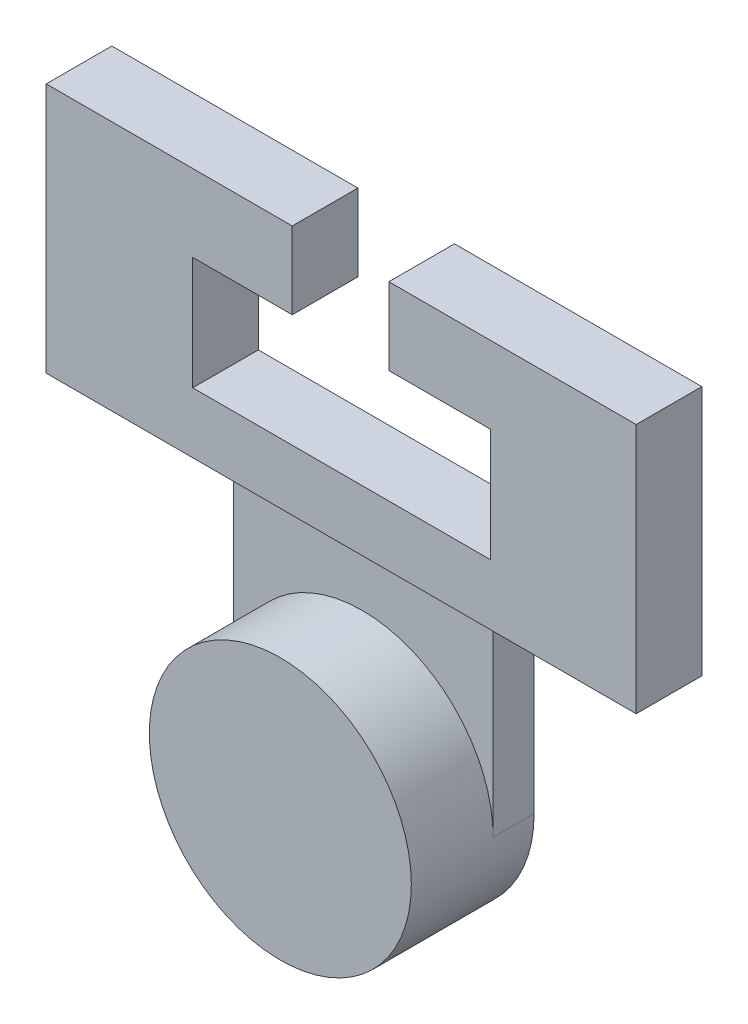
ISO-10303-21;
HEADER;
FILE_DESCRIPTION(('STEP AP214'),'2;1');
FILE_NAME('part.step','',(''),(''),'','','');
FILE_SCHEMA(('AUTOMOTIVE_DESIGN { 1 0 10303 214 1 1 1 1 }'));
ENDSEC;
DATA;
#1=APPLICATION_CONTEXT('core data for automotive mechanical design processes');
#2=APPLICATION_PROTOCOL_DEFINITION('international standard','automotive_design',2000,#1);
#3=PRODUCT_CONTEXT('',#1,'mechanical');
#4=PRODUCT('Part','Part','',(#3));
#5=PRODUCT_RELATED_PRODUCT_CATEGORY('part','',(#4));
#6=PRODUCT_DEFINITION_FORMATION('','',#4);
#7=PRODUCT_DEFINITION_CONTEXT('part definition',#1,'design');
#8=PRODUCT_DEFINITION('design','',#6,#7);
#9=PRODUCT_DEFINITION_SHAPE('','',#8);
#10=(LENGTH_UNIT() NAMED_UNIT(*) SI_UNIT(.MILLI.,.METRE.));
#11=(NAMED_UNIT(*) PLANE_ANGLE_UNIT() SI_UNIT($,.RADIAN.));
#12=(NAMED_UNIT(*) SI_UNIT($,.STERADIAN.) SOLID_ANGLE_UNIT());
#13=UNCERTAINTY_MEASURE_WITH_UNIT(LENGTH_MEASURE(1.E-05),#10,'distance_accuracy_value','');
#14=(GEOMETRIC_REPRESENTATION_CONTEXT(3) GLOBAL_UNCERTAINTY_ASSIGNED_CONTEXT((#13)) GLOBAL_UNIT_ASSIGNED_CONTEXT((#10,
#11,#12)) REPRESENTATION_CONTEXT('',''));
#15=CARTESIAN_POINT('',(0.,0.,0.));
#16=DIRECTION('',(0.,0.,1.));
#17=DIRECTION('',(1.,0.,0.));
#18=AXIS2_PLACEMENT_3D('',#15,#16,#17);
#19=CARTESIAN_POINT('',(0.,0.,-9.525));
#20=DIRECTION('',(0.,0.,1.));
#21=DIRECTION('',(1.,0.,0.));
#22=AXIS2_PLACEMENT_3D('',#19,#20,#21);
#23=CYLINDRICAL_SURFACE('',#22,10.16);
#24=DIRECTION('',(0.,0.,1.));
#25=VECTOR('',#24,1.);
#26=CARTESIAN_POINT('',(-9.99152441464391,1.84256339689434,-9.525));
#27=LINE('',#26,#25);
#28=CARTESIAN_POINT('',(-9.99152441464391,1.84256339689432,-9.525));
#29=VERTEX_POINT('',#28);
#30=CARTESIAN_POINT('',(-9.99152441464391,1.84256339689432,-6.35));
#31=VERTEX_POINT('',#30);
#32=EDGE_CURVE('E319',#29,#31,#27,.T.);
#33=ORIENTED_EDGE('',*,*,#32,.F.);
#34=CARTESIAN_POINT('',(0.,0.,-9.525));
#35=DIRECTION('',(0.,0.,1.));
#36=DIRECTION('',(1.,0.,0.));
#37=AXIS2_PLACEMENT_3D('',#34,#35,#36);
#38=CIRCLE('',#37,10.16);
#39=CARTESIAN_POINT('',(10.16,0.,-9.525));
#40=VERTEX_POINT('',#39);
#41=EDGE_CURVE('E52',#29,#40,#38,.T.);
#42=ORIENTED_EDGE('',*,*,#41,.T.);
#43=DIRECTION('',(0.,0.,-1.));
#44=VECTOR('',#43,1.);
#45=CARTESIAN_POINT('',(10.16,0.,-6.35));
#46=LINE('',#45,#44);
#47=CARTESIAN_POINT('',(10.16,0.,-6.35));
#48=VERTEX_POINT('',#47);
#49=EDGE_CURVE('E309',#48,#40,#46,.T.);
#50=ORIENTED_EDGE('',*,*,#49,.F.);
#51=CARTESIAN_POINT('',(0.,0.,-6.35));
#52=DIRECTION('',(0.,0.,1.));
#53=DIRECTION('',(1.,0.,0.));
#54=AXIS2_PLACEMENT_3D('',#51,#52,#53);
#55=CIRCLE('',#54,10.16);
#56=EDGE_CURVE('E11',#31,#48,#55,.F.);
#57=ORIENTED_EDGE('',*,*,#56,.F.);
#58=EDGE_LOOP('',(#33,#42,#50,#57));
#59=FACE_BOUND('',#58,.T.);
#60=CARTESIAN_POINT('',(0.,0.,0.));
#61=DIRECTION('',(0.,0.,1.));
#62=DIRECTION('',(1.,0.,0.));
#63=AXIS2_PLACEMENT_3D('',#60,#61,#62);
#64=CIRCLE('',#63,10.16);
#65=CARTESIAN_POINT('',(10.16,0.,0.));
#66=VERTEX_POINT('',#65);
#67=EDGE_CURVE('E332',#66,#66,#64,.T.);
#68=ORIENTED_EDGE('',*,*,#67,.F.);
#69=EDGE_LOOP('',(#68));
#70=FACE_BOUND('',#69,.T.);
#71=ADVANCED_FACE('F44',(#59,#70),#23,.T.);
#72=CARTESIAN_POINT('',(0.,0.,-9.525));
#73=DIRECTION('',(0.,0.,1.));
#74=DIRECTION('',(1.,0.,0.));
#75=AXIS2_PLACEMENT_3D('',#72,#73,#74);
#76=PLANE('',#75);
#77=ORIENTED_EDGE('',*,*,#41,.F.);
#78=DIRECTION('',(0.,1.,0.));
#79=VECTOR('',#78,1.);
#80=CARTESIAN_POINT('',(-9.99152441464391,0.,-9.525));
#81=LINE('',#80,#79);
#82=CARTESIAN_POINT('',(-9.99152441464391,15.7544963007669,-9.525));
#83=VERTEX_POINT('',#82);
#84=EDGE_CURVE('E303',#29,#83,#81,.T.);
#85=ORIENTED_EDGE('',*,*,#84,.T.);
#86=DIRECTION('',(-1.,0.,0.));
#87=VECTOR('',#86,1.);
#88=CARTESIAN_POINT('',(-9.99152441464391,15.7544963007669,-9.525));
#89=LINE('',#88,#87);
#90=CARTESIAN_POINT('',(-22.5940298544979,15.7544963007669,-9.525));
#91=VERTEX_POINT('',#90);
#92=EDGE_CURVE('E254',#83,#91,#89,.T.);
#93=ORIENTED_EDGE('',*,*,#92,.T.);
#94=DIRECTION('',(0.,-1.,0.));
#95=VECTOR('',#94,1.);
#96=CARTESIAN_POINT('',(-22.5940298544979,20.4534963007669,-9.525));
#97=LINE('',#96,#95);
#98=CARTESIAN_POINT('',(-22.5940298544979,35.1854963007669,-9.525));
#99=VERTEX_POINT('',#98);
#100=EDGE_CURVE('E169',#99,#91,#97,.T.);
#101=ORIENTED_EDGE('',*,*,#100,.F.);
#102=DIRECTION('',(-1.,0.,0.));
#103=VECTOR('',#102,1.);
#104=CARTESIAN_POINT('',(-22.5940298544979,35.1854963007669,-9.525));
#105=LINE('',#104,#103);
#106=CARTESIAN_POINT('',(-3.51021879319782,35.1854963007669,-9.525));
#107=VERTEX_POINT('',#106);
#108=EDGE_CURVE('E184',#107,#99,#105,.T.);
#109=ORIENTED_EDGE('',*,*,#108,.F.);
#110=DIRECTION('',(0.,-1.,0.));
#111=VECTOR('',#110,1.);
#112=CARTESIAN_POINT('',(-3.51021879319782,35.1854963007669,-9.525));
#113=LINE('',#112,#111);
#114=CARTESIAN_POINT('',(-3.51021879319782,29.2164963007669,-9.525));
#115=VERTEX_POINT('',#114);
#116=EDGE_CURVE('E197',#107,#115,#113,.T.);
#117=ORIENTED_EDGE('',*,*,#116,.T.);
#118=DIRECTION('',(-1.,0.,0.));
#119=VECTOR('',#118,1.);
#120=CARTESIAN_POINT('',(-22.5940298544979,29.2164963007669,-9.525));
#121=LINE('',#120,#119);
#122=CARTESIAN_POINT('',(-11.2292856636925,29.2164963007669,-9.525));
#123=VERTEX_POINT('',#122);
#124=EDGE_CURVE('E189',#115,#123,#121,.T.);
#125=ORIENTED_EDGE('',*,*,#124,.T.);
#126=DIRECTION('',(0.,-1.,0.));
#127=VECTOR('',#126,1.);
#128=CARTESIAN_POINT('',(-11.2292856636925,29.2164963007669,-9.525));
#129=LINE('',#128,#127);
#130=CARTESIAN_POINT('',(-11.2292856636925,20.4534963007669,-9.525));
#131=VERTEX_POINT('',#130);
#132=EDGE_CURVE('E242',#123,#131,#129,.T.);
#133=ORIENTED_EDGE('',*,*,#132,.T.);
#134=DIRECTION('',(-1.,0.,0.));
#135=VECTOR('',#134,1.);
#136=CARTESIAN_POINT('',(23.1661170587528,20.4534963007669,-9.525));
#137=LINE('',#136,#135);
#138=CARTESIAN_POINT('',(11.8519896998851,20.4534963007669,-9.525));
#139=VERTEX_POINT('',#138);
#140=EDGE_CURVE('E267',#139,#131,#137,.T.);
#141=ORIENTED_EDGE('',*,*,#140,.F.);
#142=DIRECTION('',(0.,-1.,0.));
#143=VECTOR('',#142,1.);
#144=CARTESIAN_POINT('',(11.8519896998851,29.2164963007669,-9.525));
#145=LINE('',#144,#143);
#146=CARTESIAN_POINT('',(11.8519896998851,29.2164963007669,-9.525));
#147=VERTEX_POINT('',#146);
#148=EDGE_CURVE('E207',#147,#139,#145,.T.);
#149=ORIENTED_EDGE('',*,*,#148,.F.);
#150=DIRECTION('',(-1.,0.,0.));
#151=VECTOR('',#150,1.);
#152=CARTESIAN_POINT('',(23.1661170587528,29.2164963007669,-9.525));
#153=LINE('',#152,#151);
#154=CARTESIAN_POINT('',(3.98107233357738,29.2164963007669,-9.525));
#155=VERTEX_POINT('',#154);
#156=EDGE_CURVE('E203',#147,#155,#153,.T.);
#157=ORIENTED_EDGE('',*,*,#156,.T.);
#158=DIRECTION('',(0.,-1.,0.));
#159=VECTOR('',#158,1.);
#160=CARTESIAN_POINT('',(3.98107233357738,35.1854963007669,-9.525));
#161=LINE('',#160,#159);
#162=CARTESIAN_POINT('',(3.98107233357738,35.1854963007669,-9.525));
#163=VERTEX_POINT('',#162);
#164=EDGE_CURVE('E209',#163,#155,#161,.T.);
#165=ORIENTED_EDGE('',*,*,#164,.F.);
#166=DIRECTION('',(-1.,0.,0.));
#167=VECTOR('',#166,1.);
#168=CARTESIAN_POINT('',(23.1661170587528,35.1854963007669,-9.525));
#169=LINE('',#168,#167);
#170=CARTESIAN_POINT('',(23.1661170587528,35.1854963007669,-9.525));
#171=VERTEX_POINT('',#170);
#172=EDGE_CURVE('E231',#171,#163,#169,.T.);
#173=ORIENTED_EDGE('',*,*,#172,.F.);
#174=DIRECTION('',(0.,-1.,0.));
#175=VECTOR('',#174,1.);
#176=CARTESIAN_POINT('',(23.1661170587528,20.4534963007669,-9.525));
#177=LINE('',#176,#175);
#178=CARTESIAN_POINT('',(23.1661170587528,15.7544963007669,-9.525));
#179=VERTEX_POINT('',#178);
#180=EDGE_CURVE('E277',#171,#179,#177,.T.);
#181=ORIENTED_EDGE('',*,*,#180,.T.);
#182=CARTESIAN_POINT('',(10.16,15.7544963007669,-9.525));
#183=VERTEX_POINT('',#182);
#184=EDGE_CURVE('E280',#179,#183,#89,.T.);
#185=ORIENTED_EDGE('',*,*,#184,.T.);
#186=DIRECTION('',(0.,-1.,0.));
#187=VECTOR('',#186,1.);
#188=CARTESIAN_POINT('',(10.16,0.,-9.525));
#189=LINE('',#188,#187);
#190=EDGE_CURVE('E296',#183,#40,#189,.T.);
#191=ORIENTED_EDGE('',*,*,#190,.T.);
#192=EDGE_LOOP('',(#77,#85,#93,#101,#109,#117,#125,#133,#141,#149,#157,#165,#173,#181,#185,#191));
#193=FACE_BOUND('',#192,.T.);
#194=ADVANCED_FACE('F337',(#193),#76,.F.);
#195=CARTESIAN_POINT('',(0.,0.,0.));
#196=DIRECTION('',(0.,0.,1.));
#197=DIRECTION('',(1.,0.,0.));
#198=AXIS2_PLACEMENT_3D('',#195,#196,#197);
#199=PLANE('',#198);
#200=ORIENTED_EDGE('',*,*,#67,.T.);
#201=EDGE_LOOP('',(#200));
#202=FACE_BOUND('',#201,.T.);
#203=ADVANCED_FACE('F336',(#202),#199,.T.);
#204=CARTESIAN_POINT('',(10.16,0.,-6.35));
#205=DIRECTION('',(1.,0.,0.));
#206=DIRECTION('',(0.,0.,-1.));
#207=AXIS2_PLACEMENT_3D('',#204,#205,#206);
#208=PLANE('',#207);
#209=ORIENTED_EDGE('',*,*,#190,.F.);
#210=DIRECTION('',(0.,0.,-1.));
#211=VECTOR('',#210,1.);
#212=CARTESIAN_POINT('',(10.16,15.7544963007669,-6.35));
#213=LINE('',#212,#211);
#214=CARTESIAN_POINT('',(10.16,15.7544963007669,-6.35));
#215=VERTEX_POINT('',#214);
#216=EDGE_CURVE('E316',#215,#183,#213,.T.);
#217=ORIENTED_EDGE('',*,*,#216,.F.);
#218=DIRECTION('',(0.,-1.,0.));
#219=VECTOR('',#218,1.);
#220=CARTESIAN_POINT('',(10.16,0.,-6.35));
#221=LINE('',#220,#219);
#222=EDGE_CURVE('E300',#215,#48,#221,.T.);
#223=ORIENTED_EDGE('',*,*,#222,.T.);
#224=ORIENTED_EDGE('',*,*,#49,.T.);
#225=EDGE_LOOP('',(#209,#217,#223,#224));
#226=FACE_BOUND('',#225,.T.);
#227=ADVANCED_FACE('F395',(#226),#208,.T.);
#228=CARTESIAN_POINT('',(-9.99152441464391,0.,-6.35));
#229=DIRECTION('',(-1.,0.,0.));
#230=DIRECTION('',(0.,0.,1.));
#231=AXIS2_PLACEMENT_3D('',#228,#229,#230);
#232=PLANE('',#231);
#233=ORIENTED_EDGE('',*,*,#84,.F.);
#234=ORIENTED_EDGE('',*,*,#32,.T.);
#235=DIRECTION('',(0.,1.,0.));
#236=VECTOR('',#235,1.);
#237=CARTESIAN_POINT('',(-9.99152441464391,0.,-6.35));
#238=LINE('',#237,#236);
#239=CARTESIAN_POINT('',(-9.99152441464391,15.7544963007669,-6.35));
#240=VERTEX_POINT('',#239);
#241=EDGE_CURVE('E305',#31,#240,#238,.T.);
#242=ORIENTED_EDGE('',*,*,#241,.T.);
#243=DIRECTION('',(0.,0.,-1.));
#244=VECTOR('',#243,1.);
#245=CARTESIAN_POINT('',(-9.99152441464391,15.7544963007669,-6.35));
#246=LINE('',#245,#244);
#247=EDGE_CURVE('E321',#240,#83,#246,.T.);
#248=ORIENTED_EDGE('',*,*,#247,.T.);
#249=EDGE_LOOP('',(#233,#234,#242,#248));
#250=FACE_BOUND('',#249,.T.);
#251=ADVANCED_FACE('F355',(#250),#232,.T.);
#252=CARTESIAN_POINT('',(0.,0.,-6.35));
#253=DIRECTION('',(0.,0.,1.));
#254=DIRECTION('',(1.,0.,0.));
#255=AXIS2_PLACEMENT_3D('',#252,#253,#254);
#256=PLANE('',#255);
#257=ORIENTED_EDGE('',*,*,#241,.F.);
#258=ORIENTED_EDGE('',*,*,#56,.T.);
#259=ORIENTED_EDGE('',*,*,#222,.F.);
#260=DIRECTION('',(1.,0.,0.));
#261=VECTOR('',#260,1.);
#262=CARTESIAN_POINT('',(10.16,15.7544963007669,-6.35));
#263=LINE('',#262,#261);
#264=EDGE_CURVE('E308',#240,#215,#263,.T.);
#265=ORIENTED_EDGE('',*,*,#264,.F.);
#266=EDGE_LOOP('',(#257,#258,#259,#265));
#267=FACE_BOUND('',#266,.T.);
#268=ADVANCED_FACE('F392',(#267),#256,.T.);
#269=CARTESIAN_POINT('',(-22.5940298544979,20.4534963007669,-9.525));
#270=DIRECTION('',(1.,0.,0.));
#271=DIRECTION('',(0.,0.,-1.));
#272=AXIS2_PLACEMENT_3D('',#269,#270,#271);
#273=PLANE('',#272);
#274=DIRECTION('',(0.,0.,1.));
#275=VECTOR('',#274,1.);
#276=CARTESIAN_POINT('',(-22.5940298544979,15.7544963007669,-9.525));
#277=LINE('',#276,#275);
#278=CARTESIAN_POINT('',(-22.5940298544979,15.7544963007669,-4.4350592362056));
#279=VERTEX_POINT('',#278);
#280=EDGE_CURVE('E163',#91,#279,#277,.T.);
#281=ORIENTED_EDGE('',*,*,#280,.T.);
#282=DIRECTION('',(0.,-1.,0.));
#283=VECTOR('',#282,1.);
#284=CARTESIAN_POINT('',(-22.5940298544979,20.4534963007669,-4.4350592362056));
#285=LINE('',#284,#283);
#286=CARTESIAN_POINT('',(-22.5940298544979,35.1854963007669,-4.4350592362056));
#287=VERTEX_POINT('',#286);
#288=EDGE_CURVE('E160',#287,#279,#285,.T.);
#289=ORIENTED_EDGE('',*,*,#288,.F.);
#290=DIRECTION('',(0.,0.,1.));
#291=VECTOR('',#290,1.);
#292=CARTESIAN_POINT('',(-22.5940298544979,35.1854963007669,-9.525));
#293=LINE('',#292,#291);
#294=EDGE_CURVE('E165',#99,#287,#293,.T.);
#295=ORIENTED_EDGE('',*,*,#294,.F.);
#296=ORIENTED_EDGE('',*,*,#100,.T.);
#297=EDGE_LOOP('',(#281,#289,#295,#296));
#298=FACE_BOUND('',#297,.T.);
#299=ADVANCED_FACE('F157',(#298),#273,.F.);
#300=CARTESIAN_POINT('',(-22.5940298544979,20.4534963007669,-4.4350592362056));
#301=DIRECTION('',(0.,0.,-1.));
#302=DIRECTION('',(-1.,0.,0.));
#303=AXIS2_PLACEMENT_3D('',#300,#301,#302);
#304=PLANE('',#303);
#305=DIRECTION('',(1.,0.,0.));
#306=VECTOR('',#305,1.);
#307=CARTESIAN_POINT('',(-22.5940298544979,15.7544963007669,-4.4350592362056));
#308=LINE('',#307,#306);
#309=CARTESIAN_POINT('',(23.1661170587528,15.7544963007669,-4.4350592362056));
#310=VERTEX_POINT('',#309);
#311=EDGE_CURVE('E285',#279,#310,#308,.T.);
#312=ORIENTED_EDGE('',*,*,#311,.T.);
#313=DIRECTION('',(0.,-1.,0.));
#314=VECTOR('',#313,1.);
#315=CARTESIAN_POINT('',(23.1661170587528,20.4534963007669,-4.4350592362056));
#316=LINE('',#315,#314);
#317=CARTESIAN_POINT('',(23.1661170587528,35.1854963007669,-4.4350592362056));
#318=VERTEX_POINT('',#317);
#319=EDGE_CURVE('E166',#318,#310,#316,.T.);
#320=ORIENTED_EDGE('',*,*,#319,.F.);
#321=DIRECTION('',(1.,0.,0.));
#322=VECTOR('',#321,1.);
#323=CARTESIAN_POINT('',(23.1661170587528,35.1854963007669,-4.4350592362056));
#324=LINE('',#323,#322);
#325=CARTESIAN_POINT('',(3.98107233357738,35.1854963007669,-4.4350592362056));
#326=VERTEX_POINT('',#325);
#327=EDGE_CURVE('E217',#326,#318,#324,.T.);
#328=ORIENTED_EDGE('',*,*,#327,.F.);
#329=DIRECTION('',(0.,-1.,0.));
#330=VECTOR('',#329,1.);
#331=CARTESIAN_POINT('',(3.98107233357738,35.1854963007669,-4.4350592362056));
#332=LINE('',#331,#330);
#333=CARTESIAN_POINT('',(3.98107233357738,29.2164963007669,-4.4350592362056));
#334=VERTEX_POINT('',#333);
#335=EDGE_CURVE('E212',#326,#334,#332,.T.);
#336=ORIENTED_EDGE('',*,*,#335,.T.);
#337=DIRECTION('',(1.,0.,0.));
#338=VECTOR('',#337,1.);
#339=CARTESIAN_POINT('',(23.1661170587528,29.2164963007669,-4.4350592362056));
#340=LINE('',#339,#338);
#341=CARTESIAN_POINT('',(11.8519896998851,29.2164963007669,-4.4350592362056));
#342=VERTEX_POINT('',#341);
#343=EDGE_CURVE('E218',#334,#342,#340,.T.);
#344=ORIENTED_EDGE('',*,*,#343,.T.);
#345=DIRECTION('',(0.,-1.,0.));
#346=VECTOR('',#345,1.);
#347=CARTESIAN_POINT('',(11.8519896998851,29.2164963007669,-4.4350592362056));
#348=LINE('',#347,#346);
#349=CARTESIAN_POINT('',(11.8519896998851,20.4534963007669,-4.4350592362056));
#350=VERTEX_POINT('',#349);
#351=EDGE_CURVE('E259',#342,#350,#348,.T.);
#352=ORIENTED_EDGE('',*,*,#351,.T.);
#353=DIRECTION('',(1.,0.,0.));
#354=VECTOR('',#353,1.);
#355=CARTESIAN_POINT('',(-22.5940298544979,20.4534963007669,-4.4350592362056));
#356=LINE('',#355,#354);
#357=CARTESIAN_POINT('',(-11.2292856636925,20.4534963007669,-4.4350592362056));
#358=VERTEX_POINT('',#357);
#359=EDGE_CURVE('E275',#358,#350,#356,.T.);
#360=ORIENTED_EDGE('',*,*,#359,.F.);
#361=DIRECTION('',(0.,-1.,0.));
#362=VECTOR('',#361,1.);
#363=CARTESIAN_POINT('',(-11.2292856636925,29.2164963007669,-4.4350592362056));
#364=LINE('',#363,#362);
#365=CARTESIAN_POINT('',(-11.2292856636925,29.2164963007669,-4.4350592362056));
#366=VERTEX_POINT('',#365);
#367=EDGE_CURVE('E253',#366,#358,#364,.T.);
#368=ORIENTED_EDGE('',*,*,#367,.F.);
#369=DIRECTION('',(1.,0.,0.));
#370=VECTOR('',#369,1.);
#371=CARTESIAN_POINT('',(-22.5940298544979,29.2164963007669,-4.4350592362056));
#372=LINE('',#371,#370);
#373=CARTESIAN_POINT('',(-3.51021879319782,29.2164963007669,-4.4350592362056));
#374=VERTEX_POINT('',#373);
#375=EDGE_CURVE('E196',#366,#374,#372,.T.);
#376=ORIENTED_EDGE('',*,*,#375,.T.);
#377=DIRECTION('',(0.,-1.,0.));
#378=VECTOR('',#377,1.);
#379=CARTESIAN_POINT('',(-3.51021879319782,35.1854963007669,-4.4350592362056));
#380=LINE('',#379,#378);
#381=CARTESIAN_POINT('',(-3.51021879319782,35.1854963007669,-4.4350592362056));
#382=VERTEX_POINT('',#381);
#383=EDGE_CURVE('E172',#382,#374,#380,.T.);
#384=ORIENTED_EDGE('',*,*,#383,.F.);
#385=DIRECTION('',(1.,0.,0.));
#386=VECTOR('',#385,1.);
#387=CARTESIAN_POINT('',(-22.5940298544979,35.1854963007669,-4.4350592362056));
#388=LINE('',#387,#386);
#389=EDGE_CURVE('E171',#287,#382,#388,.T.);
#390=ORIENTED_EDGE('',*,*,#389,.F.);
#391=ORIENTED_EDGE('',*,*,#288,.T.);
#392=EDGE_LOOP('',(#312,#320,#328,#336,#344,#352,#360,#368,#376,#384,#390,#391));
#393=FACE_BOUND('',#392,.T.);
#394=ADVANCED_FACE('F175',(#393),#304,.F.);
#395=CARTESIAN_POINT('',(23.1661170587528,20.4534963007669,-4.4350592362056));
#396=DIRECTION('',(-1.,0.,0.));
#397=DIRECTION('',(0.,0.,1.));
#398=AXIS2_PLACEMENT_3D('',#395,#396,#397);
#399=PLANE('',#398);
#400=DIRECTION('',(0.,0.,-1.));
#401=VECTOR('',#400,1.);
#402=CARTESIAN_POINT('',(23.1661170587528,15.7544963007669,-4.4350592362056));
#403=LINE('',#402,#401);
#404=EDGE_CURVE('E272',#310,#179,#403,.T.);
#405=ORIENTED_EDGE('',*,*,#404,.T.);
#406=ORIENTED_EDGE('',*,*,#180,.F.);
#407=DIRECTION('',(0.,0.,-1.));
#408=VECTOR('',#407,1.);
#409=CARTESIAN_POINT('',(23.1661170587528,35.1854963007669,-9.525));
#410=LINE('',#409,#408);
#411=EDGE_CURVE('E221',#318,#171,#410,.T.);
#412=ORIENTED_EDGE('',*,*,#411,.F.);
#413=ORIENTED_EDGE('',*,*,#319,.T.);
#414=EDGE_LOOP('',(#405,#406,#412,#413));
#415=FACE_BOUND('',#414,.T.);
#416=ADVANCED_FACE('F386',(#415),#399,.F.);
#417=CARTESIAN_POINT('',(0.,20.4534963007669,0.));
#418=DIRECTION('',(0.,1.,0.));
#419=DIRECTION('',(0.,0.,1.));
#420=AXIS2_PLACEMENT_3D('',#417,#418,#419);
#421=PLANE('',#420);
#422=DIRECTION('',(0.,0.,-1.));
#423=VECTOR('',#422,1.);
#424=CARTESIAN_POINT('',(-11.2292856636925,20.4534963007669,-9.525));
#425=LINE('',#424,#423);
#426=EDGE_CURVE('E58',#358,#131,#425,.T.);
#427=ORIENTED_EDGE('',*,*,#426,.F.);
#428=ORIENTED_EDGE('',*,*,#359,.T.);
#429=DIRECTION('',(0.,0.,1.));
#430=VECTOR('',#429,1.);
#431=CARTESIAN_POINT('',(11.8519896998851,20.4534963007669,-9.525));
#432=LINE('',#431,#430);
#433=EDGE_CURVE('E62',#139,#350,#432,.T.);
#434=ORIENTED_EDGE('',*,*,#433,.F.);
#435=ORIENTED_EDGE('',*,*,#140,.T.);
#436=EDGE_LOOP('',(#427,#428,#434,#435));
#437=FACE_BOUND('',#436,.T.);
#438=ADVANCED_FACE('F456',(#437),#421,.T.);
#439=CARTESIAN_POINT('',(0.,15.7544963007669,0.));
#440=DIRECTION('',(0.,1.,0.));
#441=DIRECTION('',(0.,0.,1.));
#442=AXIS2_PLACEMENT_3D('',#439,#440,#441);
#443=PLANE('',#442);
#444=ORIENTED_EDGE('',*,*,#247,.F.);
#445=ORIENTED_EDGE('',*,*,#264,.T.);
#446=ORIENTED_EDGE('',*,*,#216,.T.);
#447=ORIENTED_EDGE('',*,*,#184,.F.);
#448=ORIENTED_EDGE('',*,*,#404,.F.);
#449=ORIENTED_EDGE('',*,*,#311,.F.);
#450=ORIENTED_EDGE('',*,*,#280,.F.);
#451=ORIENTED_EDGE('',*,*,#92,.F.);
#452=EDGE_LOOP('',(#444,#445,#446,#447,#448,#449,#450,#451));
#453=FACE_BOUND('',#452,.T.);
#454=ADVANCED_FACE('F358',(#453),#443,.F.);
#455=CARTESIAN_POINT('',(11.8519896998851,29.2164963007669,-9.525));
#456=DIRECTION('',(1.,0.,0.));
#457=DIRECTION('',(0.,0.,-1.));
#458=AXIS2_PLACEMENT_3D('',#455,#456,#457);
#459=PLANE('',#458);
#460=ORIENTED_EDGE('',*,*,#433,.T.);
#461=ORIENTED_EDGE('',*,*,#351,.F.);
#462=DIRECTION('',(0.,0.,1.));
#463=VECTOR('',#462,1.);
#464=CARTESIAN_POINT('',(11.8519896998851,29.2164963007669,-9.525));
#465=LINE('',#464,#463);
#466=EDGE_CURVE('E263',#147,#342,#465,.T.);
#467=ORIENTED_EDGE('',*,*,#466,.F.);
#468=ORIENTED_EDGE('',*,*,#148,.T.);
#469=EDGE_LOOP('',(#460,#461,#467,#468));
#470=FACE_BOUND('',#469,.T.);
#471=ADVANCED_FACE('F375',(#470),#459,.F.);
#472=CARTESIAN_POINT('',(-11.2292856636925,29.2164963007669,-9.525));
#473=DIRECTION('',(-1.,0.,0.));
#474=DIRECTION('',(0.,0.,1.));
#475=AXIS2_PLACEMENT_3D('',#472,#473,#474);
#476=PLANE('',#475);
#477=ORIENTED_EDGE('',*,*,#426,.T.);
#478=ORIENTED_EDGE('',*,*,#132,.F.);
#479=DIRECTION('',(0.,0.,-1.));
#480=VECTOR('',#479,1.);
#481=CARTESIAN_POINT('',(-11.2292856636925,29.2164963007669,-9.525));
#482=LINE('',#481,#480);
#483=EDGE_CURVE('E244',#366,#123,#482,.T.);
#484=ORIENTED_EDGE('',*,*,#483,.F.);
#485=ORIENTED_EDGE('',*,*,#367,.T.);
#486=EDGE_LOOP('',(#477,#478,#484,#485));
#487=FACE_BOUND('',#486,.T.);
#488=ADVANCED_FACE('F369',(#487),#476,.F.);
#489=CARTESIAN_POINT('',(0.,29.2164963007669,0.));
#490=DIRECTION('',(0.,1.,0.));
#491=DIRECTION('',(0.,0.,1.));
#492=AXIS2_PLACEMENT_3D('',#489,#490,#491);
#493=PLANE('',#492);
#494=ORIENTED_EDGE('',*,*,#375,.F.);
#495=ORIENTED_EDGE('',*,*,#483,.T.);
#496=ORIENTED_EDGE('',*,*,#124,.F.);
#497=DIRECTION('',(0.,0.,-1.));
#498=VECTOR('',#497,1.);
#499=CARTESIAN_POINT('',(-3.51021879319782,29.2164963007669,-9.525));
#500=LINE('',#499,#498);
#501=EDGE_CURVE('E187',#374,#115,#500,.T.);
#502=ORIENTED_EDGE('',*,*,#501,.F.);
#503=EDGE_LOOP('',(#494,#495,#496,#502));
#504=FACE_BOUND('',#503,.T.);
#505=ADVANCED_FACE('F368',(#504),#493,.F.);
#506=CARTESIAN_POINT('',(-3.51021879319782,35.1854963007669,-9.525));
#507=DIRECTION('',(-1.,0.,0.));
#508=DIRECTION('',(0.,0.,1.));
#509=AXIS2_PLACEMENT_3D('',#506,#507,#508);
#510=PLANE('',#509);
#511=ORIENTED_EDGE('',*,*,#501,.T.);
#512=ORIENTED_EDGE('',*,*,#116,.F.);
#513=DIRECTION('',(0.,0.,-1.));
#514=VECTOR('',#513,1.);
#515=CARTESIAN_POINT('',(-3.51021879319782,35.1854963007669,-9.525));
#516=LINE('',#515,#514);
#517=EDGE_CURVE('E179',#382,#107,#516,.T.);
#518=ORIENTED_EDGE('',*,*,#517,.F.);
#519=ORIENTED_EDGE('',*,*,#383,.T.);
#520=EDGE_LOOP('',(#511,#512,#518,#519));
#521=FACE_BOUND('',#520,.T.);
#522=ADVANCED_FACE('F497',(#521),#510,.F.);
#523=CARTESIAN_POINT('',(0.,35.1854963007669,0.));
#524=DIRECTION('',(0.,1.,0.));
#525=DIRECTION('',(0.,0.,1.));
#526=AXIS2_PLACEMENT_3D('',#523,#524,#525);
#527=PLANE('',#526);
#528=ORIENTED_EDGE('',*,*,#294,.T.);
#529=ORIENTED_EDGE('',*,*,#389,.T.);
#530=ORIENTED_EDGE('',*,*,#517,.T.);
#531=ORIENTED_EDGE('',*,*,#108,.T.);
#532=EDGE_LOOP('',(#528,#529,#530,#531));
#533=FACE_BOUND('',#532,.T.);
#534=ADVANCED_FACE('F185',(#533),#527,.T.);
#535=CARTESIAN_POINT('',(3.98107233357738,35.1854963007669,-9.525));
#536=DIRECTION('',(1.,0.,0.));
#537=DIRECTION('',(0.,0.,-1.));
#538=AXIS2_PLACEMENT_3D('',#535,#536,#537);
#539=PLANE('',#538);
#540=DIRECTION('',(0.,0.,1.));
#541=VECTOR('',#540,1.);
#542=CARTESIAN_POINT('',(3.98107233357738,29.2164963007669,-9.525));
#543=LINE('',#542,#541);
#544=EDGE_CURVE('E224',#155,#334,#543,.T.);
#545=ORIENTED_EDGE('',*,*,#544,.T.);
#546=ORIENTED_EDGE('',*,*,#335,.F.);
#547=DIRECTION('',(0.,0.,1.));
#548=VECTOR('',#547,1.);
#549=CARTESIAN_POINT('',(3.98107233357738,35.1854963007669,-9.525));
#550=LINE('',#549,#548);
#551=EDGE_CURVE('E235',#163,#326,#550,.T.);
#552=ORIENTED_EDGE('',*,*,#551,.F.);
#553=ORIENTED_EDGE('',*,*,#164,.T.);
#554=EDGE_LOOP('',(#545,#546,#552,#553));
#555=FACE_BOUND('',#554,.T.);
#556=ADVANCED_FACE('F385',(#555),#539,.F.);
#557=CARTESIAN_POINT('',(0.,35.1854963007669,0.));
#558=DIRECTION('',(0.,-1.,0.));
#559=DIRECTION('',(0.,0.,-1.));
#560=AXIS2_PLACEMENT_3D('',#557,#558,#559);
#561=PLANE('',#560);
#562=ORIENTED_EDGE('',*,*,#411,.T.);
#563=ORIENTED_EDGE('',*,*,#172,.T.);
#564=ORIENTED_EDGE('',*,*,#551,.T.);
#565=ORIENTED_EDGE('',*,*,#327,.T.);
#566=EDGE_LOOP('',(#562,#563,#564,#565));
#567=FACE_BOUND('',#566,.T.);
#568=ADVANCED_FACE('F387',(#567),#561,.F.);
#569=CARTESIAN_POINT('',(0.,29.2164963007669,0.));
#570=DIRECTION('',(0.,-1.,0.));
#571=DIRECTION('',(0.,0.,-1.));
#572=AXIS2_PLACEMENT_3D('',#569,#570,#571);
#573=PLANE('',#572);
#574=ORIENTED_EDGE('',*,*,#156,.F.);
#575=ORIENTED_EDGE('',*,*,#466,.T.);
#576=ORIENTED_EDGE('',*,*,#343,.F.);
#577=ORIENTED_EDGE('',*,*,#544,.F.);
#578=EDGE_LOOP('',(#574,#575,#576,#577));
#579=FACE_BOUND('',#578,.T.);
#580=ADVANCED_FACE('F380',(#579),#573,.T.);
#581=CLOSED_SHELL('',(#71,#194,#203,#227,#251,#268,#299,#394,#416,#438,#454,#471,#488,#505,#522,
#534,#556,#568,#580));
#582=MANIFOLD_SOLID_BREP('B2',#581);
#583=ADVANCED_BREP_SHAPE_REPRESENTATION('',(#18,#582),#14);
#584=SHAPE_DEFINITION_REPRESENTATION(#9,#583);
ENDSEC;
END-ISO-10303-21;
